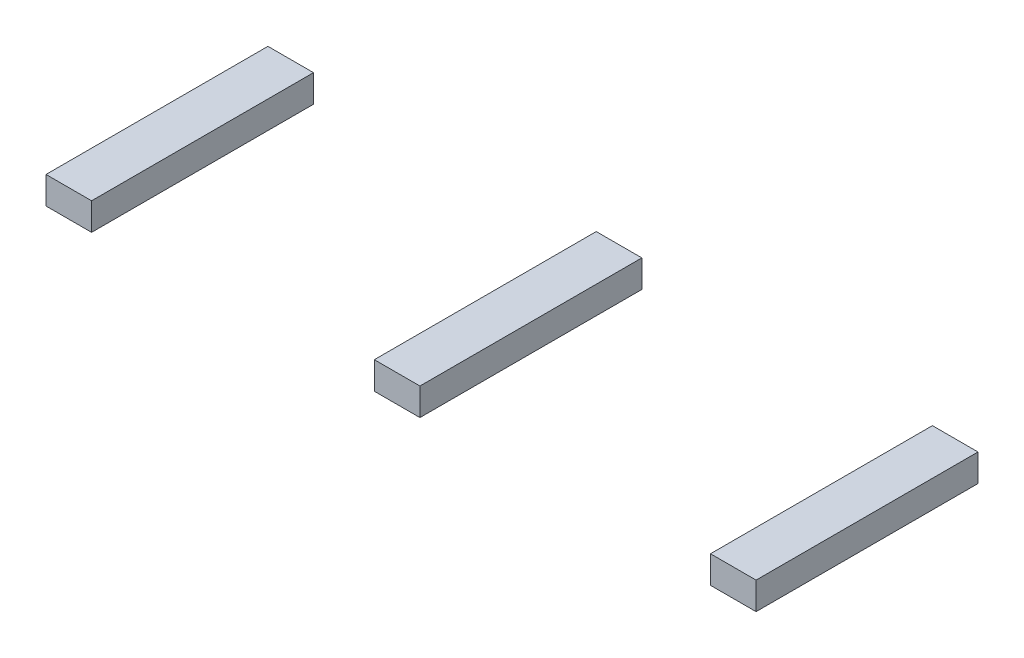
ISO-10303-21;
HEADER;
FILE_DESCRIPTION(('STEP AP214'),'2;1');
FILE_NAME('part.step','',(''),(''),'','','');
FILE_SCHEMA(('AUTOMOTIVE_DESIGN { 1 0 10303 214 1 1 1 1 }'));
ENDSEC;
DATA;
#1=APPLICATION_CONTEXT('core data for automotive mechanical design processes');
#2=APPLICATION_PROTOCOL_DEFINITION('international standard','automotive_design',2000,#1);
#3=PRODUCT_CONTEXT('',#1,'mechanical');
#4=PRODUCT('Part','Part','',(#3));
#5=PRODUCT_RELATED_PRODUCT_CATEGORY('part','',(#4));
#6=PRODUCT_DEFINITION_FORMATION('','',#4);
#7=PRODUCT_DEFINITION_CONTEXT('part definition',#1,'design');
#8=PRODUCT_DEFINITION('design','',#6,#7);
#9=PRODUCT_DEFINITION_SHAPE('','',#8);
#10=(LENGTH_UNIT() NAMED_UNIT(*) SI_UNIT(.MILLI.,.METRE.));
#11=(NAMED_UNIT(*) PLANE_ANGLE_UNIT() SI_UNIT($,.RADIAN.));
#12=(NAMED_UNIT(*) SI_UNIT($,.STERADIAN.) SOLID_ANGLE_UNIT());
#13=UNCERTAINTY_MEASURE_WITH_UNIT(LENGTH_MEASURE(1.E-05),#10,'distance_accuracy_value','');
#14=(GEOMETRIC_REPRESENTATION_CONTEXT(3) GLOBAL_UNCERTAINTY_ASSIGNED_CONTEXT((#13)) GLOBAL_UNIT_ASSIGNED_CONTEXT((#10,
#11,#12)) REPRESENTATION_CONTEXT('',''));
#15=CARTESIAN_POINT('',(0.,0.,0.));
#16=DIRECTION('',(0.,0.,1.));
#17=DIRECTION('',(1.,0.,0.));
#18=AXIS2_PLACEMENT_3D('',#15,#16,#17);
#19=CARTESIAN_POINT('',(5.15387875483465,-0.225,3.65));
#20=DIRECTION('',(1.,0.,0.));
#21=DIRECTION('',(0.,0.,-1.));
#22=AXIS2_PLACEMENT_3D('',#19,#20,#21);
#23=PLANE('',#22);
#24=DIRECTION('',(0.,-1.,0.));
#25=VECTOR('',#24,1.);
#26=CARTESIAN_POINT('',(5.15387875483465,-0.225,0.));
#27=LINE('',#26,#25);
#28=CARTESIAN_POINT('',(5.15387875483465,0.225,0.));
#29=VERTEX_POINT('',#28);
#30=CARTESIAN_POINT('',(5.15387875483465,-0.225,0.));
#31=VERTEX_POINT('',#30);
#32=EDGE_CURVE('E107',#29,#31,#27,.T.);
#33=ORIENTED_EDGE('',*,*,#32,.T.);
#34=DIRECTION('',(0.,0.,-1.));
#35=VECTOR('',#34,1.);
#36=CARTESIAN_POINT('',(5.15387875483465,-0.225,3.65));
#37=LINE('',#36,#35);
#38=CARTESIAN_POINT('',(5.15387875483465,-0.225,3.65));
#39=VERTEX_POINT('',#38);
#40=EDGE_CURVE('E12',#39,#31,#37,.T.);
#41=ORIENTED_EDGE('',*,*,#40,.F.);
#42=DIRECTION('',(0.,-1.,0.));
#43=VECTOR('',#42,1.);
#44=CARTESIAN_POINT('',(5.15387875483465,-0.225,3.65));
#45=LINE('',#44,#43);
#46=CARTESIAN_POINT('',(5.15387875483465,0.225,3.65));
#47=VERTEX_POINT('',#46);
#48=EDGE_CURVE('E95',#47,#39,#45,.T.);
#49=ORIENTED_EDGE('',*,*,#48,.F.);
#50=DIRECTION('',(0.,0.,-1.));
#51=VECTOR('',#50,1.);
#52=CARTESIAN_POINT('',(5.15387875483465,0.225,3.65));
#53=LINE('',#52,#51);
#54=EDGE_CURVE('E103',#47,#29,#53,.T.);
#55=ORIENTED_EDGE('',*,*,#54,.T.);
#56=EDGE_LOOP('',(#33,#41,#49,#55));
#57=FACE_BOUND('',#56,.T.);
#58=ADVANCED_FACE('F44',(#57),#23,.F.);
#59=CARTESIAN_POINT('',(5.90387875483465,-0.225,3.65));
#60=DIRECTION('',(0.,1.,0.));
#61=DIRECTION('',(-1.,0.,0.));
#62=AXIS2_PLACEMENT_3D('',#59,#60,#61);
#63=PLANE('',#62);
#64=DIRECTION('',(1.,0.,0.));
#65=VECTOR('',#64,1.);
#66=CARTESIAN_POINT('',(5.90387875483465,-0.225,0.));
#67=LINE('',#66,#65);
#68=CARTESIAN_POINT('',(5.90387875483465,-0.225,0.));
#69=VERTEX_POINT('',#68);
#70=EDGE_CURVE('E99',#31,#69,#67,.T.);
#71=ORIENTED_EDGE('',*,*,#70,.T.);
#72=DIRECTION('',(0.,0.,-1.));
#73=VECTOR('',#72,1.);
#74=CARTESIAN_POINT('',(5.90387875483465,-0.225,3.65));
#75=LINE('',#74,#73);
#76=CARTESIAN_POINT('',(5.90387875483465,-0.225,3.65));
#77=VERTEX_POINT('',#76);
#78=EDGE_CURVE('E52',#77,#69,#75,.T.);
#79=ORIENTED_EDGE('',*,*,#78,.F.);
#80=DIRECTION('',(1.,0.,0.));
#81=VECTOR('',#80,1.);
#82=CARTESIAN_POINT('',(5.90387875483465,-0.225,3.65));
#83=LINE('',#82,#81);
#84=EDGE_CURVE('E90',#39,#77,#83,.T.);
#85=ORIENTED_EDGE('',*,*,#84,.F.);
#86=ORIENTED_EDGE('',*,*,#40,.T.);
#87=EDGE_LOOP('',(#71,#79,#85,#86));
#88=FACE_BOUND('',#87,.T.);
#89=ADVANCED_FACE('F98',(#88),#63,.F.);
#90=CARTESIAN_POINT('',(5.90387875483465,-0.225,3.65));
#91=DIRECTION('',(-1.,0.,0.));
#92=DIRECTION('',(0.,0.,1.));
#93=AXIS2_PLACEMENT_3D('',#90,#91,#92);
#94=PLANE('',#93);
#95=DIRECTION('',(0.,1.,0.));
#96=VECTOR('',#95,1.);
#97=CARTESIAN_POINT('',(5.90387875483465,-0.225,0.));
#98=LINE('',#97,#96);
#99=CARTESIAN_POINT('',(5.90387875483465,0.225,0.));
#100=VERTEX_POINT('',#99);
#101=EDGE_CURVE('E77',#69,#100,#98,.T.);
#102=ORIENTED_EDGE('',*,*,#101,.T.);
#103=DIRECTION('',(0.,0.,-1.));
#104=VECTOR('',#103,1.);
#105=CARTESIAN_POINT('',(5.90387875483465,0.225,3.65));
#106=LINE('',#105,#104);
#107=CARTESIAN_POINT('',(5.90387875483465,0.225,3.65));
#108=VERTEX_POINT('',#107);
#109=EDGE_CURVE('E100',#108,#100,#106,.T.);
#110=ORIENTED_EDGE('',*,*,#109,.F.);
#111=DIRECTION('',(0.,1.,0.));
#112=VECTOR('',#111,1.);
#113=CARTESIAN_POINT('',(5.90387875483465,-0.225,3.65));
#114=LINE('',#113,#112);
#115=EDGE_CURVE('E93',#77,#108,#114,.T.);
#116=ORIENTED_EDGE('',*,*,#115,.F.);
#117=ORIENTED_EDGE('',*,*,#78,.T.);
#118=EDGE_LOOP('',(#102,#110,#116,#117));
#119=FACE_BOUND('',#118,.T.);
#120=ADVANCED_FACE('F101',(#119),#94,.F.);
#121=CARTESIAN_POINT('',(5.90387875483465,0.225,3.65));
#122=DIRECTION('',(0.,-1.,0.));
#123=DIRECTION('',(1.,0.,0.));
#124=AXIS2_PLACEMENT_3D('',#121,#122,#123);
#125=PLANE('',#124);
#126=DIRECTION('',(-1.,0.,0.));
#127=VECTOR('',#126,1.);
#128=CARTESIAN_POINT('',(5.90387875483465,0.225,0.));
#129=LINE('',#128,#127);
#130=EDGE_CURVE('E83',#100,#29,#129,.T.);
#131=ORIENTED_EDGE('',*,*,#130,.T.);
#132=ORIENTED_EDGE('',*,*,#54,.F.);
#133=DIRECTION('',(-1.,0.,0.));
#134=VECTOR('',#133,1.);
#135=CARTESIAN_POINT('',(5.90387875483465,0.225,3.65));
#136=LINE('',#135,#134);
#137=EDGE_CURVE('E60',#108,#47,#136,.T.);
#138=ORIENTED_EDGE('',*,*,#137,.F.);
#139=ORIENTED_EDGE('',*,*,#109,.T.);
#140=EDGE_LOOP('',(#131,#132,#138,#139));
#141=FACE_BOUND('',#140,.T.);
#142=ADVANCED_FACE('F114',(#141),#125,.F.);
#143=CARTESIAN_POINT('',(0.,0.,3.65));
#144=DIRECTION('',(0.,0.,1.));
#145=DIRECTION('',(1.,0.,0.));
#146=AXIS2_PLACEMENT_3D('',#143,#144,#145);
#147=PLANE('',#146);
#148=ORIENTED_EDGE('',*,*,#48,.T.);
#149=ORIENTED_EDGE('',*,*,#84,.T.);
#150=ORIENTED_EDGE('',*,*,#115,.T.);
#151=ORIENTED_EDGE('',*,*,#137,.T.);
#152=EDGE_LOOP('',(#148,#149,#150,#151));
#153=FACE_BOUND('',#152,.T.);
#154=ADVANCED_FACE('F91',(#153),#147,.T.);
#155=CARTESIAN_POINT('',(0.,0.,0.));
#156=DIRECTION('',(0.,0.,1.));
#157=DIRECTION('',(1.,0.,0.));
#158=AXIS2_PLACEMENT_3D('',#155,#156,#157);
#159=PLANE('',#158);
#160=ORIENTED_EDGE('',*,*,#32,.F.);
#161=ORIENTED_EDGE('',*,*,#130,.F.);
#162=ORIENTED_EDGE('',*,*,#101,.F.);
#163=ORIENTED_EDGE('',*,*,#70,.F.);
#164=EDGE_LOOP('',(#160,#161,#162,#163));
#165=FACE_BOUND('',#164,.T.);
#166=ADVANCED_FACE('F117',(#165),#159,.F.);
#167=CLOSED_SHELL('',(#58,#89,#120,#142,#154,#166));
#168=MANIFOLD_SOLID_BREP('B2',#167);
#169=CARTESIAN_POINT('',(0.375,-0.225,3.65));
#170=DIRECTION('',(-1.,0.,0.));
#171=DIRECTION('',(0.,0.,1.));
#172=AXIS2_PLACEMENT_3D('',#169,#170,#171);
#173=PLANE('',#172);
#174=DIRECTION('',(0.,1.,0.));
#175=VECTOR('',#174,1.);
#176=CARTESIAN_POINT('',(0.375,-0.225,0.));
#177=LINE('',#176,#175);
#178=CARTESIAN_POINT('',(0.375,-0.225,0.));
#179=VERTEX_POINT('',#178);
#180=CARTESIAN_POINT('',(0.375,0.225,0.));
#181=VERTEX_POINT('',#180);
#182=EDGE_CURVE('E240',#179,#181,#177,.T.);
#183=ORIENTED_EDGE('',*,*,#182,.T.);
#184=DIRECTION('',(0.,0.,-1.));
#185=VECTOR('',#184,1.);
#186=CARTESIAN_POINT('',(0.375,0.225,3.65));
#187=LINE('',#186,#185);
#188=CARTESIAN_POINT('',(0.375,0.225,3.65));
#189=VERTEX_POINT('',#188);
#190=EDGE_CURVE('E42',#189,#181,#187,.T.);
#191=ORIENTED_EDGE('',*,*,#190,.F.);
#192=DIRECTION('',(0.,1.,0.));
#193=VECTOR('',#192,1.);
#194=CARTESIAN_POINT('',(0.375,-0.225,3.65));
#195=LINE('',#194,#193);
#196=CARTESIAN_POINT('',(0.375,-0.225,3.65));
#197=VERTEX_POINT('',#196);
#198=EDGE_CURVE('E228',#197,#189,#195,.T.);
#199=ORIENTED_EDGE('',*,*,#198,.F.);
#200=DIRECTION('',(0.,0.,-1.));
#201=VECTOR('',#200,1.);
#202=CARTESIAN_POINT('',(0.375,-0.225,3.65));
#203=LINE('',#202,#201);
#204=EDGE_CURVE('E236',#197,#179,#203,.T.);
#205=ORIENTED_EDGE('',*,*,#204,.T.);
#206=EDGE_LOOP('',(#183,#191,#199,#205));
#207=FACE_BOUND('',#206,.T.);
#208=ADVANCED_FACE('F177',(#207),#173,.F.);
#209=CARTESIAN_POINT('',(-0.375,0.225,3.65));
#210=DIRECTION('',(0.,-1.,0.));
#211=DIRECTION('',(0.,0.,-1.));
#212=AXIS2_PLACEMENT_3D('',#209,#210,#211);
#213=PLANE('',#212);
#214=DIRECTION('',(-1.,0.,0.));
#215=VECTOR('',#214,1.);
#216=CARTESIAN_POINT('',(-0.375,0.225,0.));
#217=LINE('',#216,#215);
#218=CARTESIAN_POINT('',(-0.375,0.225,0.));
#219=VERTEX_POINT('',#218);
#220=EDGE_CURVE('E232',#181,#219,#217,.T.);
#221=ORIENTED_EDGE('',*,*,#220,.T.);
#222=DIRECTION('',(0.,0.,-1.));
#223=VECTOR('',#222,1.);
#224=CARTESIAN_POINT('',(-0.375,0.225,3.65));
#225=LINE('',#224,#223);
#226=CARTESIAN_POINT('',(-0.375,0.225,3.65));
#227=VERTEX_POINT('',#226);
#228=EDGE_CURVE('E185',#227,#219,#225,.T.);
#229=ORIENTED_EDGE('',*,*,#228,.F.);
#230=DIRECTION('',(-1.,0.,0.));
#231=VECTOR('',#230,1.);
#232=CARTESIAN_POINT('',(-0.375,0.225,3.65));
#233=LINE('',#232,#231);
#234=EDGE_CURVE('E223',#189,#227,#233,.T.);
#235=ORIENTED_EDGE('',*,*,#234,.F.);
#236=ORIENTED_EDGE('',*,*,#190,.T.);
#237=EDGE_LOOP('',(#221,#229,#235,#236));
#238=FACE_BOUND('',#237,.T.);
#239=ADVANCED_FACE('F231',(#238),#213,.F.);
#240=CARTESIAN_POINT('',(-0.375,-0.225,3.65));
#241=DIRECTION('',(1.,0.,0.));
#242=DIRECTION('',(0.,0.,-1.));
#243=AXIS2_PLACEMENT_3D('',#240,#241,#242);
#244=PLANE('',#243);
#245=DIRECTION('',(0.,-1.,0.));
#246=VECTOR('',#245,1.);
#247=CARTESIAN_POINT('',(-0.375,-0.225,0.));
#248=LINE('',#247,#246);
#249=CARTESIAN_POINT('',(-0.375,-0.225,0.));
#250=VERTEX_POINT('',#249);
#251=EDGE_CURVE('E210',#219,#250,#248,.T.);
#252=ORIENTED_EDGE('',*,*,#251,.T.);
#253=DIRECTION('',(0.,0.,-1.));
#254=VECTOR('',#253,1.);
#255=CARTESIAN_POINT('',(-0.375,-0.225,3.65));
#256=LINE('',#255,#254);
#257=CARTESIAN_POINT('',(-0.375,-0.225,3.65));
#258=VERTEX_POINT('',#257);
#259=EDGE_CURVE('E233',#258,#250,#256,.T.);
#260=ORIENTED_EDGE('',*,*,#259,.F.);
#261=DIRECTION('',(0.,-1.,0.));
#262=VECTOR('',#261,1.);
#263=CARTESIAN_POINT('',(-0.375,-0.225,3.65));
#264=LINE('',#263,#262);
#265=EDGE_CURVE('E226',#227,#258,#264,.T.);
#266=ORIENTED_EDGE('',*,*,#265,.F.);
#267=ORIENTED_EDGE('',*,*,#228,.T.);
#268=EDGE_LOOP('',(#252,#260,#266,#267));
#269=FACE_BOUND('',#268,.T.);
#270=ADVANCED_FACE('F234',(#269),#244,.F.);
#271=CARTESIAN_POINT('',(-0.375,-0.225,3.65));
#272=DIRECTION('',(0.,1.,0.));
#273=DIRECTION('',(0.,0.,1.));
#274=AXIS2_PLACEMENT_3D('',#271,#272,#273);
#275=PLANE('',#274);
#276=DIRECTION('',(1.,0.,0.));
#277=VECTOR('',#276,1.);
#278=CARTESIAN_POINT('',(-0.375,-0.225,0.));
#279=LINE('',#278,#277);
#280=EDGE_CURVE('E216',#250,#179,#279,.T.);
#281=ORIENTED_EDGE('',*,*,#280,.T.);
#282=ORIENTED_EDGE('',*,*,#204,.F.);
#283=DIRECTION('',(1.,0.,0.));
#284=VECTOR('',#283,1.);
#285=CARTESIAN_POINT('',(-0.375,-0.225,3.65));
#286=LINE('',#285,#284);
#287=EDGE_CURVE('E193',#258,#197,#286,.T.);
#288=ORIENTED_EDGE('',*,*,#287,.F.);
#289=ORIENTED_EDGE('',*,*,#259,.T.);
#290=EDGE_LOOP('',(#281,#282,#288,#289));
#291=FACE_BOUND('',#290,.T.);
#292=ADVANCED_FACE('F247',(#291),#275,.F.);
#293=CARTESIAN_POINT('',(0.,0.,3.65));
#294=DIRECTION('',(0.,0.,-1.));
#295=DIRECTION('',(-1.,0.,0.));
#296=AXIS2_PLACEMENT_3D('',#293,#294,#295);
#297=PLANE('',#296);
#298=ORIENTED_EDGE('',*,*,#198,.T.);
#299=ORIENTED_EDGE('',*,*,#234,.T.);
#300=ORIENTED_EDGE('',*,*,#265,.T.);
#301=ORIENTED_EDGE('',*,*,#287,.T.);
#302=EDGE_LOOP('',(#298,#299,#300,#301));
#303=FACE_BOUND('',#302,.T.);
#304=ADVANCED_FACE('F224',(#303),#297,.F.);
#305=CARTESIAN_POINT('',(0.,0.,0.));
#306=DIRECTION('',(0.,0.,-1.));
#307=DIRECTION('',(-1.,0.,0.));
#308=AXIS2_PLACEMENT_3D('',#305,#306,#307);
#309=PLANE('',#308);
#310=ORIENTED_EDGE('',*,*,#182,.F.);
#311=ORIENTED_EDGE('',*,*,#280,.F.);
#312=ORIENTED_EDGE('',*,*,#251,.F.);
#313=ORIENTED_EDGE('',*,*,#220,.F.);
#314=EDGE_LOOP('',(#310,#311,#312,#313));
#315=FACE_BOUND('',#314,.T.);
#316=ADVANCED_FACE('F250',(#315),#309,.T.);
#317=CLOSED_SHELL('',(#208,#239,#270,#292,#304,#316));
#318=MANIFOLD_SOLID_BREP('B6',#317);
#319=CARTESIAN_POINT('',(-5.02522913689309,-0.286703164788787,3.65));
#320=DIRECTION('',(-1.,0.,0.));
#321=DIRECTION('',(0.,0.,1.));
#322=AXIS2_PLACEMENT_3D('',#319,#320,#321);
#323=PLANE('',#322);
#324=DIRECTION('',(0.,1.,0.));
#325=VECTOR('',#324,1.);
#326=CARTESIAN_POINT('',(-5.02522913689309,-0.286703164788787,0.));
#327=LINE('',#326,#325);
#328=CARTESIAN_POINT('',(-5.02522913689309,-0.286703164788787,0.));
#329=VERTEX_POINT('',#328);
#330=CARTESIAN_POINT('',(-5.02522913689309,0.163296835211213,0.));
#331=VERTEX_POINT('',#330);
#332=EDGE_CURVE('E364',#329,#331,#327,.T.);
#333=ORIENTED_EDGE('',*,*,#332,.T.);
#334=DIRECTION('',(0.,0.,-1.));
#335=VECTOR('',#334,1.);
#336=CARTESIAN_POINT('',(-5.02522913689309,0.163296835211213,3.65));
#337=LINE('',#336,#335);
#338=CARTESIAN_POINT('',(-5.02522913689309,0.163296835211213,3.65));
#339=VERTEX_POINT('',#338);
#340=EDGE_CURVE('E175',#339,#331,#337,.T.);
#341=ORIENTED_EDGE('',*,*,#340,.F.);
#342=DIRECTION('',(0.,1.,0.));
#343=VECTOR('',#342,1.);
#344=CARTESIAN_POINT('',(-5.02522913689309,-0.286703164788787,3.65));
#345=LINE('',#344,#343);
#346=CARTESIAN_POINT('',(-5.02522913689309,-0.286703164788787,3.65));
#347=VERTEX_POINT('',#346);
#348=EDGE_CURVE('E352',#347,#339,#345,.T.);
#349=ORIENTED_EDGE('',*,*,#348,.F.);
#350=DIRECTION('',(0.,0.,-1.));
#351=VECTOR('',#350,1.);
#352=CARTESIAN_POINT('',(-5.02522913689309,-0.286703164788787,3.65));
#353=LINE('',#352,#351);
#354=EDGE_CURVE('E360',#347,#329,#353,.T.);
#355=ORIENTED_EDGE('',*,*,#354,.T.);
#356=EDGE_LOOP('',(#333,#341,#349,#355));
#357=FACE_BOUND('',#356,.T.);
#358=ADVANCED_FACE('F301',(#357),#323,.F.);
#359=CARTESIAN_POINT('',(-5.77522913689309,0.163296835211213,3.65));
#360=DIRECTION('',(0.,-1.,0.));
#361=DIRECTION('',(0.,0.,-1.));
#362=AXIS2_PLACEMENT_3D('',#359,#360,#361);
#363=PLANE('',#362);
#364=DIRECTION('',(-1.,0.,0.));
#365=VECTOR('',#364,1.);
#366=CARTESIAN_POINT('',(-5.77522913689309,0.163296835211213,0.));
#367=LINE('',#366,#365);
#368=CARTESIAN_POINT('',(-5.77522913689309,0.163296835211213,0.));
#369=VERTEX_POINT('',#368);
#370=EDGE_CURVE('E356',#331,#369,#367,.T.);
#371=ORIENTED_EDGE('',*,*,#370,.T.);
#372=DIRECTION('',(0.,0.,-1.));
#373=VECTOR('',#372,1.);
#374=CARTESIAN_POINT('',(-5.77522913689309,0.163296835211213,3.65));
#375=LINE('',#374,#373);
#376=CARTESIAN_POINT('',(-5.77522913689309,0.163296835211213,3.65));
#377=VERTEX_POINT('',#376);
#378=EDGE_CURVE('E309',#377,#369,#375,.T.);
#379=ORIENTED_EDGE('',*,*,#378,.F.);
#380=DIRECTION('',(-1.,0.,0.));
#381=VECTOR('',#380,1.);
#382=CARTESIAN_POINT('',(-5.77522913689309,0.163296835211213,3.65));
#383=LINE('',#382,#381);
#384=EDGE_CURVE('E347',#339,#377,#383,.T.);
#385=ORIENTED_EDGE('',*,*,#384,.F.);
#386=ORIENTED_EDGE('',*,*,#340,.T.);
#387=EDGE_LOOP('',(#371,#379,#385,#386));
#388=FACE_BOUND('',#387,.T.);
#389=ADVANCED_FACE('F355',(#388),#363,.F.);
#390=CARTESIAN_POINT('',(-5.77522913689309,-0.286703164788787,3.65));
#391=DIRECTION('',(1.,0.,0.));
#392=DIRECTION('',(0.,0.,-1.));
#393=AXIS2_PLACEMENT_3D('',#390,#391,#392);
#394=PLANE('',#393);
#395=DIRECTION('',(0.,-1.,0.));
#396=VECTOR('',#395,1.);
#397=CARTESIAN_POINT('',(-5.77522913689309,-0.286703164788787,0.));
#398=LINE('',#397,#396);
#399=CARTESIAN_POINT('',(-5.77522913689309,-0.286703164788787,0.));
#400=VERTEX_POINT('',#399);
#401=EDGE_CURVE('E334',#369,#400,#398,.T.);
#402=ORIENTED_EDGE('',*,*,#401,.T.);
#403=DIRECTION('',(0.,0.,-1.));
#404=VECTOR('',#403,1.);
#405=CARTESIAN_POINT('',(-5.77522913689309,-0.286703164788787,3.65));
#406=LINE('',#405,#404);
#407=CARTESIAN_POINT('',(-5.77522913689309,-0.286703164788787,3.65));
#408=VERTEX_POINT('',#407);
#409=EDGE_CURVE('E357',#408,#400,#406,.T.);
#410=ORIENTED_EDGE('',*,*,#409,.F.);
#411=DIRECTION('',(0.,-1.,0.));
#412=VECTOR('',#411,1.);
#413=CARTESIAN_POINT('',(-5.77522913689309,-0.286703164788787,3.65));
#414=LINE('',#413,#412);
#415=EDGE_CURVE('E350',#377,#408,#414,.T.);
#416=ORIENTED_EDGE('',*,*,#415,.F.);
#417=ORIENTED_EDGE('',*,*,#378,.T.);
#418=EDGE_LOOP('',(#402,#410,#416,#417));
#419=FACE_BOUND('',#418,.T.);
#420=ADVANCED_FACE('F358',(#419),#394,.F.);
#421=CARTESIAN_POINT('',(-5.77522913689309,-0.286703164788787,3.65));
#422=DIRECTION('',(0.,1.,0.));
#423=DIRECTION('',(0.,0.,1.));
#424=AXIS2_PLACEMENT_3D('',#421,#422,#423);
#425=PLANE('',#424);
#426=DIRECTION('',(1.,0.,0.));
#427=VECTOR('',#426,1.);
#428=CARTESIAN_POINT('',(-5.77522913689309,-0.286703164788787,0.));
#429=LINE('',#428,#427);
#430=EDGE_CURVE('E340',#400,#329,#429,.T.);
#431=ORIENTED_EDGE('',*,*,#430,.T.);
#432=ORIENTED_EDGE('',*,*,#354,.F.);
#433=DIRECTION('',(1.,0.,0.));
#434=VECTOR('',#433,1.);
#435=CARTESIAN_POINT('',(-5.77522913689309,-0.286703164788787,3.65));
#436=LINE('',#435,#434);
#437=EDGE_CURVE('E317',#408,#347,#436,.T.);
#438=ORIENTED_EDGE('',*,*,#437,.F.);
#439=ORIENTED_EDGE('',*,*,#409,.T.);
#440=EDGE_LOOP('',(#431,#432,#438,#439));
#441=FACE_BOUND('',#440,.T.);
#442=ADVANCED_FACE('F371',(#441),#425,.F.);
#443=CARTESIAN_POINT('',(0.,0.,3.65));
#444=DIRECTION('',(0.,0.,-1.));
#445=DIRECTION('',(-1.,0.,0.));
#446=AXIS2_PLACEMENT_3D('',#443,#444,#445);
#447=PLANE('',#446);
#448=ORIENTED_EDGE('',*,*,#348,.T.);
#449=ORIENTED_EDGE('',*,*,#384,.T.);
#450=ORIENTED_EDGE('',*,*,#415,.T.);
#451=ORIENTED_EDGE('',*,*,#437,.T.);
#452=EDGE_LOOP('',(#448,#449,#450,#451));
#453=FACE_BOUND('',#452,.T.);
#454=ADVANCED_FACE('F348',(#453),#447,.F.);
#455=CARTESIAN_POINT('',(0.,0.,0.));
#456=DIRECTION('',(0.,0.,-1.));
#457=DIRECTION('',(-1.,0.,0.));
#458=AXIS2_PLACEMENT_3D('',#455,#456,#457);
#459=PLANE('',#458);
#460=ORIENTED_EDGE('',*,*,#332,.F.);
#461=ORIENTED_EDGE('',*,*,#430,.F.);
#462=ORIENTED_EDGE('',*,*,#401,.F.);
#463=ORIENTED_EDGE('',*,*,#370,.F.);
#464=EDGE_LOOP('',(#460,#461,#462,#463));
#465=FACE_BOUND('',#464,.T.);
#466=ADVANCED_FACE('F374',(#465),#459,.T.);
#467=CLOSED_SHELL('',(#358,#389,#420,#442,#454,#466));
#468=MANIFOLD_SOLID_BREP('B36',#467);
#469=ADVANCED_BREP_SHAPE_REPRESENTATION('',(#18,#168,#318,#468),#14);
#470=SHAPE_DEFINITION_REPRESENTATION(#9,#469);
ENDSEC;
END-ISO-10303-21;
